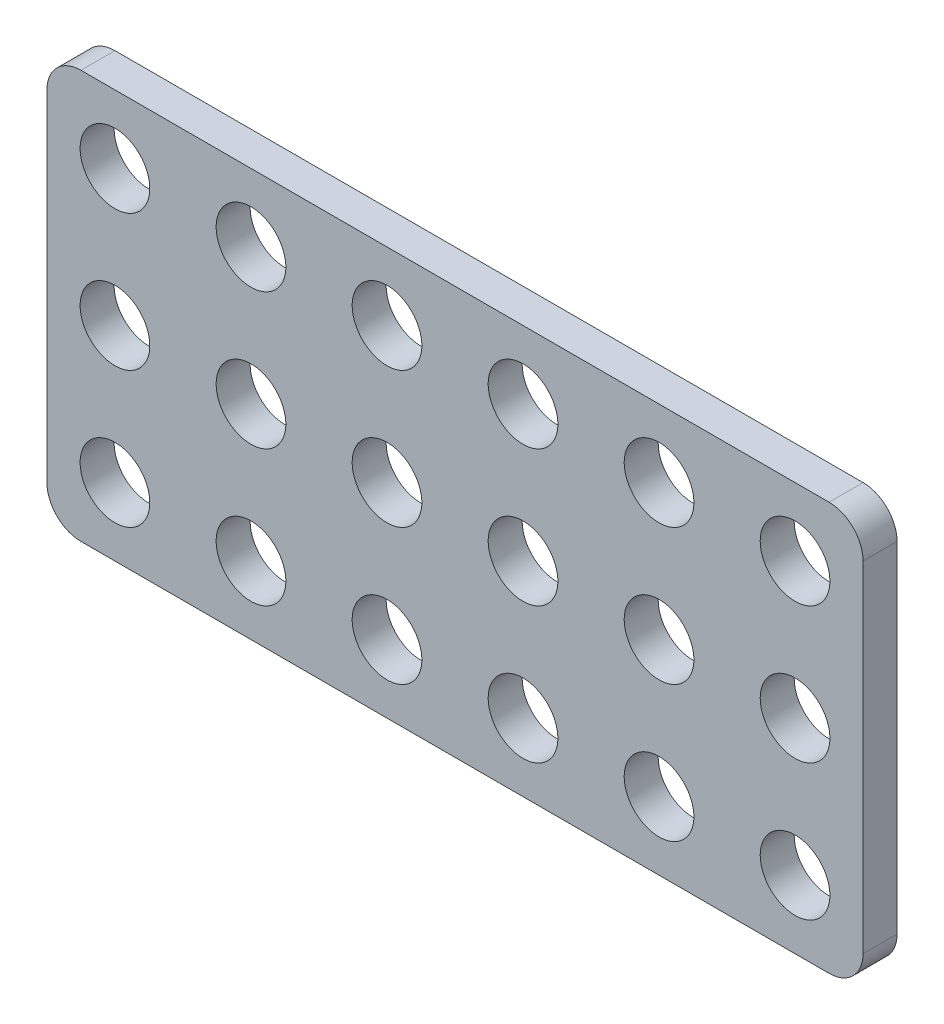
ISO-10303-21;
HEADER;
FILE_DESCRIPTION(('STEP AP214'),'2;1');
FILE_NAME('part.step','',(''),(''),'','','');
FILE_SCHEMA(('AUTOMOTIVE_DESIGN { 1 0 10303 214 1 1 1 1 }'));
ENDSEC;
DATA;
#1=APPLICATION_CONTEXT('core data for automotive mechanical design processes');
#2=APPLICATION_PROTOCOL_DEFINITION('international standard','automotive_design',2000,#1);
#3=PRODUCT_CONTEXT('',#1,'mechanical');
#4=PRODUCT('Part','Part','',(#3));
#5=PRODUCT_RELATED_PRODUCT_CATEGORY('part','',(#4));
#6=PRODUCT_DEFINITION_FORMATION('','',#4);
#7=PRODUCT_DEFINITION_CONTEXT('part definition',#1,'design');
#8=PRODUCT_DEFINITION('design','',#6,#7);
#9=PRODUCT_DEFINITION_SHAPE('','',#8);
#10=(LENGTH_UNIT() NAMED_UNIT(*) SI_UNIT(.MILLI.,.METRE.));
#11=(NAMED_UNIT(*) PLANE_ANGLE_UNIT() SI_UNIT($,.RADIAN.));
#12=(NAMED_UNIT(*) SI_UNIT($,.STERADIAN.) SOLID_ANGLE_UNIT());
#13=UNCERTAINTY_MEASURE_WITH_UNIT(LENGTH_MEASURE(1.E-05),#10,'distance_accuracy_value','');
#14=(GEOMETRIC_REPRESENTATION_CONTEXT(3) GLOBAL_UNCERTAINTY_ASSIGNED_CONTEXT((#13)) GLOBAL_UNIT_ASSIGNED_CONTEXT((#10,
#11,#12)) REPRESENTATION_CONTEXT('',''));
#15=CARTESIAN_POINT('',(0.,0.,0.));
#16=DIRECTION('',(0.,0.,1.));
#17=DIRECTION('',(1.,0.,0.));
#18=AXIS2_PLACEMENT_3D('',#15,#16,#17);
#19=CARTESIAN_POINT('',(-4.,-4.,0.));
#20=DIRECTION('',(0.,0.,1.));
#21=DIRECTION('',(1.,0.,0.));
#22=AXIS2_PLACEMENT_3D('',#19,#20,#21);
#23=PLANE('',#22);
#24=CARTESIAN_POINT('',(39.9999999999999,16.,0.));
#25=DIRECTION('',(0.,0.,-1.));
#26=DIRECTION('',(-1.,0.,0.));
#27=AXIS2_PLACEMENT_3D('',#24,#25,#26);
#28=CIRCLE('',#27,2.05);
#29=CARTESIAN_POINT('',(37.9499999999999,16.,0.));
#30=VERTEX_POINT('',#29);
#31=EDGE_CURVE('E184',#30,#30,#28,.F.);
#32=ORIENTED_EDGE('',*,*,#31,.T.);
#33=EDGE_LOOP('',(#32));
#34=FACE_BOUND('',#33,.T.);
#35=CARTESIAN_POINT('',(23.9999999999999,16.,0.));
#36=DIRECTION('',(0.,0.,-1.));
#37=DIRECTION('',(-1.,0.,0.));
#38=AXIS2_PLACEMENT_3D('',#35,#36,#37);
#39=CIRCLE('',#38,2.05);
#40=CARTESIAN_POINT('',(21.9499999999999,16.,0.));
#41=VERTEX_POINT('',#40);
#42=EDGE_CURVE('E187',#41,#41,#39,.F.);
#43=ORIENTED_EDGE('',*,*,#42,.T.);
#44=EDGE_LOOP('',(#43));
#45=FACE_BOUND('',#44,.T.);
#46=CARTESIAN_POINT('',(7.99999999999994,16.,0.));
#47=DIRECTION('',(0.,0.,-1.));
#48=DIRECTION('',(-1.,0.,0.));
#49=AXIS2_PLACEMENT_3D('',#46,#47,#48);
#50=CIRCLE('',#49,2.05);
#51=CARTESIAN_POINT('',(5.94999999999995,16.,0.));
#52=VERTEX_POINT('',#51);
#53=EDGE_CURVE('E190',#52,#52,#50,.F.);
#54=ORIENTED_EDGE('',*,*,#53,.T.);
#55=EDGE_LOOP('',(#54));
#56=FACE_BOUND('',#55,.T.);
#57=CARTESIAN_POINT('',(40.,8.,0.));
#58=DIRECTION('',(0.,0.,-1.));
#59=DIRECTION('',(-1.,0.,0.));
#60=AXIS2_PLACEMENT_3D('',#57,#58,#59);
#61=CIRCLE('',#60,2.05);
#62=CARTESIAN_POINT('',(37.95,8.,0.));
#63=VERTEX_POINT('',#62);
#64=EDGE_CURVE('E193',#63,#63,#61,.F.);
#65=ORIENTED_EDGE('',*,*,#64,.T.);
#66=EDGE_LOOP('',(#65));
#67=FACE_BOUND('',#66,.T.);
#68=CARTESIAN_POINT('',(24.,8.,0.));
#69=DIRECTION('',(0.,0.,-1.));
#70=DIRECTION('',(-1.,0.,0.));
#71=AXIS2_PLACEMENT_3D('',#68,#69,#70);
#72=CIRCLE('',#71,2.05);
#73=CARTESIAN_POINT('',(21.95,8.,0.));
#74=VERTEX_POINT('',#73);
#75=EDGE_CURVE('E196',#74,#74,#72,.F.);
#76=ORIENTED_EDGE('',*,*,#75,.T.);
#77=EDGE_LOOP('',(#76));
#78=FACE_BOUND('',#77,.T.);
#79=CARTESIAN_POINT('',(7.99999999999997,8.,0.));
#80=DIRECTION('',(0.,0.,-1.));
#81=DIRECTION('',(-1.,0.,0.));
#82=AXIS2_PLACEMENT_3D('',#79,#80,#81);
#83=CIRCLE('',#82,2.05);
#84=CARTESIAN_POINT('',(5.94999999999997,8.,0.));
#85=VERTEX_POINT('',#84);
#86=EDGE_CURVE('E199',#85,#85,#83,.F.);
#87=ORIENTED_EDGE('',*,*,#86,.T.);
#88=EDGE_LOOP('',(#87));
#89=FACE_BOUND('',#88,.T.);
#90=CARTESIAN_POINT('',(40.,0.,0.));
#91=DIRECTION('',(0.,0.,-1.));
#92=DIRECTION('',(-1.,0.,0.));
#93=AXIS2_PLACEMENT_3D('',#90,#91,#92);
#94=CIRCLE('',#93,2.05);
#95=CARTESIAN_POINT('',(37.95,0.,0.));
#96=VERTEX_POINT('',#95);
#97=EDGE_CURVE('E202',#96,#96,#94,.F.);
#98=ORIENTED_EDGE('',*,*,#97,.T.);
#99=EDGE_LOOP('',(#98));
#100=FACE_BOUND('',#99,.T.);
#101=CARTESIAN_POINT('',(24.,0.,0.));
#102=DIRECTION('',(0.,0.,-1.));
#103=DIRECTION('',(-1.,0.,0.));
#104=AXIS2_PLACEMENT_3D('',#101,#102,#103);
#105=CIRCLE('',#104,2.05);
#106=CARTESIAN_POINT('',(21.95,0.,0.));
#107=VERTEX_POINT('',#106);
#108=EDGE_CURVE('E205',#107,#107,#105,.F.);
#109=ORIENTED_EDGE('',*,*,#108,.T.);
#110=EDGE_LOOP('',(#109));
#111=FACE_BOUND('',#110,.T.);
#112=CARTESIAN_POINT('',(8.,0.,0.));
#113=DIRECTION('',(0.,0.,-1.));
#114=DIRECTION('',(-1.,0.,0.));
#115=AXIS2_PLACEMENT_3D('',#112,#113,#114);
#116=CIRCLE('',#115,2.05);
#117=CARTESIAN_POINT('',(5.95,0.,0.));
#118=VERTEX_POINT('',#117);
#119=EDGE_CURVE('E208',#118,#118,#116,.F.);
#120=ORIENTED_EDGE('',*,*,#119,.T.);
#121=EDGE_LOOP('',(#120));
#122=FACE_BOUND('',#121,.T.);
#123=CARTESIAN_POINT('',(-2.,-2.,0.));
#124=DIRECTION('',(0.,0.,-1.));
#125=DIRECTION('',(-1.,0.,0.));
#126=AXIS2_PLACEMENT_3D('',#123,#124,#125);
#127=CIRCLE('',#126,2.);
#128=CARTESIAN_POINT('',(-4.,-2.,0.));
#129=VERTEX_POINT('',#128);
#130=CARTESIAN_POINT('',(-2.,-4.,0.));
#131=VERTEX_POINT('',#130);
#132=EDGE_CURVE('E86',#129,#131,#127,.F.);
#133=ORIENTED_EDGE('',*,*,#132,.F.);
#134=DIRECTION('',(0.,1.,0.));
#135=VECTOR('',#134,1.);
#136=CARTESIAN_POINT('',(-4.,20.,0.));
#137=LINE('',#136,#135);
#138=CARTESIAN_POINT('',(-4.,18.,0.));
#139=VERTEX_POINT('',#138);
#140=EDGE_CURVE('E78',#129,#139,#137,.T.);
#141=ORIENTED_EDGE('',*,*,#140,.T.);
#142=CARTESIAN_POINT('',(-2.,18.,0.));
#143=DIRECTION('',(0.,0.,-1.));
#144=DIRECTION('',(-1.,0.,0.));
#145=AXIS2_PLACEMENT_3D('',#142,#143,#144);
#146=CIRCLE('',#145,2.);
#147=CARTESIAN_POINT('',(-2.,20.,0.));
#148=VERTEX_POINT('',#147);
#149=EDGE_CURVE('E212',#148,#139,#146,.F.);
#150=ORIENTED_EDGE('',*,*,#149,.F.);
#151=DIRECTION('',(1.,0.,0.));
#152=VECTOR('',#151,1.);
#153=CARTESIAN_POINT('',(-4.,20.,0.));
#154=LINE('',#153,#152);
#155=CARTESIAN_POINT('',(42.,20.,0.));
#156=VERTEX_POINT('',#155);
#157=EDGE_CURVE('E113',#148,#156,#154,.T.);
#158=ORIENTED_EDGE('',*,*,#157,.T.);
#159=CARTESIAN_POINT('',(42.,18.,0.));
#160=DIRECTION('',(0.,0.,-1.));
#161=DIRECTION('',(-1.,0.,0.));
#162=AXIS2_PLACEMENT_3D('',#159,#160,#161);
#163=CIRCLE('',#162,2.);
#164=CARTESIAN_POINT('',(44.,18.,0.));
#165=VERTEX_POINT('',#164);
#166=EDGE_CURVE('E215',#165,#156,#163,.F.);
#167=ORIENTED_EDGE('',*,*,#166,.F.);
#168=DIRECTION('',(0.,-1.,0.));
#169=VECTOR('',#168,1.);
#170=CARTESIAN_POINT('',(44.,20.,0.));
#171=LINE('',#170,#169);
#172=CARTESIAN_POINT('',(44.,-2.,0.));
#173=VERTEX_POINT('',#172);
#174=EDGE_CURVE('E117',#165,#173,#171,.T.);
#175=ORIENTED_EDGE('',*,*,#174,.T.);
#176=CARTESIAN_POINT('',(42.,-2.,0.));
#177=DIRECTION('',(0.,0.,-1.));
#178=DIRECTION('',(-1.,0.,0.));
#179=AXIS2_PLACEMENT_3D('',#176,#177,#178);
#180=CIRCLE('',#179,2.);
#181=CARTESIAN_POINT('',(42.,-4.,0.));
#182=VERTEX_POINT('',#181);
#183=EDGE_CURVE('E89',#182,#173,#180,.F.);
#184=ORIENTED_EDGE('',*,*,#183,.F.);
#185=DIRECTION('',(1.,0.,0.));
#186=VECTOR('',#185,1.);
#187=CARTESIAN_POINT('',(-4.,-4.,0.));
#188=LINE('',#187,#186);
#189=EDGE_CURVE('E83',#182,#131,#188,.F.);
#190=ORIENTED_EDGE('',*,*,#189,.T.);
#191=EDGE_LOOP('',(#133,#141,#150,#158,#167,#175,#184,#190));
#192=FACE_BOUND('',#191,.T.);
#193=CARTESIAN_POINT('',(0.,0.,0.));
#194=DIRECTION('',(0.,0.,-1.));
#195=DIRECTION('',(-1.,0.,0.));
#196=AXIS2_PLACEMENT_3D('',#193,#194,#195);
#197=CIRCLE('',#196,2.05);
#198=CARTESIAN_POINT('',(-2.05,0.,0.));
#199=VERTEX_POINT('',#198);
#200=EDGE_CURVE('E112',#199,#199,#197,.F.);
#201=ORIENTED_EDGE('',*,*,#200,.T.);
#202=EDGE_LOOP('',(#201));
#203=FACE_BOUND('',#202,.T.);
#204=CARTESIAN_POINT('',(16.,0.,0.));
#205=DIRECTION('',(0.,0.,-1.));
#206=DIRECTION('',(-1.,0.,0.));
#207=AXIS2_PLACEMENT_3D('',#204,#205,#206);
#208=CIRCLE('',#207,2.05);
#209=CARTESIAN_POINT('',(13.95,0.,0.));
#210=VERTEX_POINT('',#209);
#211=EDGE_CURVE('E221',#210,#210,#208,.F.);
#212=ORIENTED_EDGE('',*,*,#211,.T.);
#213=EDGE_LOOP('',(#212));
#214=FACE_BOUND('',#213,.T.);
#215=CARTESIAN_POINT('',(32.,0.,0.));
#216=DIRECTION('',(0.,0.,-1.));
#217=DIRECTION('',(-1.,0.,0.));
#218=AXIS2_PLACEMENT_3D('',#215,#216,#217);
#219=CIRCLE('',#218,2.05);
#220=CARTESIAN_POINT('',(29.95,0.,0.));
#221=VERTEX_POINT('',#220);
#222=EDGE_CURVE('E224',#221,#221,#219,.F.);
#223=ORIENTED_EDGE('',*,*,#222,.T.);
#224=EDGE_LOOP('',(#223));
#225=FACE_BOUND('',#224,.T.);
#226=CARTESIAN_POINT('',(0.,8.,0.));
#227=DIRECTION('',(0.,0.,-1.));
#228=DIRECTION('',(-1.,0.,0.));
#229=AXIS2_PLACEMENT_3D('',#226,#227,#228);
#230=CIRCLE('',#229,2.05);
#231=CARTESIAN_POINT('',(-2.05000000000003,8.,0.));
#232=VERTEX_POINT('',#231);
#233=EDGE_CURVE('E227',#232,#232,#230,.F.);
#234=ORIENTED_EDGE('',*,*,#233,.T.);
#235=EDGE_LOOP('',(#234));
#236=FACE_BOUND('',#235,.T.);
#237=CARTESIAN_POINT('',(16.,8.,0.));
#238=DIRECTION('',(0.,0.,-1.));
#239=DIRECTION('',(-1.,0.,0.));
#240=AXIS2_PLACEMENT_3D('',#237,#238,#239);
#241=CIRCLE('',#240,2.05);
#242=CARTESIAN_POINT('',(13.95,8.,0.));
#243=VERTEX_POINT('',#242);
#244=EDGE_CURVE('E230',#243,#243,#241,.F.);
#245=ORIENTED_EDGE('',*,*,#244,.T.);
#246=EDGE_LOOP('',(#245));
#247=FACE_BOUND('',#246,.T.);
#248=CARTESIAN_POINT('',(32.,8.,0.));
#249=DIRECTION('',(0.,0.,-1.));
#250=DIRECTION('',(-1.,0.,0.));
#251=AXIS2_PLACEMENT_3D('',#248,#249,#250);
#252=CIRCLE('',#251,2.05);
#253=CARTESIAN_POINT('',(29.95,8.,0.));
#254=VERTEX_POINT('',#253);
#255=EDGE_CURVE('E233',#254,#254,#252,.F.);
#256=ORIENTED_EDGE('',*,*,#255,.T.);
#257=EDGE_LOOP('',(#256));
#258=FACE_BOUND('',#257,.T.);
#259=CARTESIAN_POINT('',(0.,16.,0.));
#260=DIRECTION('',(0.,0.,-1.));
#261=DIRECTION('',(-1.,0.,0.));
#262=AXIS2_PLACEMENT_3D('',#259,#260,#261);
#263=CIRCLE('',#262,2.05);
#264=CARTESIAN_POINT('',(-2.05000000000006,16.,0.));
#265=VERTEX_POINT('',#264);
#266=EDGE_CURVE('E236',#265,#265,#263,.F.);
#267=ORIENTED_EDGE('',*,*,#266,.T.);
#268=EDGE_LOOP('',(#267));
#269=FACE_BOUND('',#268,.T.);
#270=CARTESIAN_POINT('',(15.9999999999999,16.,0.));
#271=DIRECTION('',(0.,0.,-1.));
#272=DIRECTION('',(-1.,0.,0.));
#273=AXIS2_PLACEMENT_3D('',#270,#271,#272);
#274=CIRCLE('',#273,2.05);
#275=CARTESIAN_POINT('',(13.9499999999999,16.,0.));
#276=VERTEX_POINT('',#275);
#277=EDGE_CURVE('E238',#276,#276,#274,.F.);
#278=ORIENTED_EDGE('',*,*,#277,.T.);
#279=EDGE_LOOP('',(#278));
#280=FACE_BOUND('',#279,.T.);
#281=CARTESIAN_POINT('',(31.9999999999999,16.,0.));
#282=DIRECTION('',(0.,0.,-1.));
#283=DIRECTION('',(-1.,0.,0.));
#284=AXIS2_PLACEMENT_3D('',#281,#282,#283);
#285=CIRCLE('',#284,2.05);
#286=CARTESIAN_POINT('',(29.9499999999999,16.,0.));
#287=VERTEX_POINT('',#286);
#288=EDGE_CURVE('E20',#287,#287,#285,.F.);
#289=ORIENTED_EDGE('',*,*,#288,.T.);
#290=EDGE_LOOP('',(#289));
#291=FACE_BOUND('',#290,.T.);
#292=ADVANCED_FACE('F17',(#34,#45,#56,#67,#78,#89,#100,#111,#122,#192,#203,#214,#225,#236,#247,
#258,#269,#280,#291),#23,.F.);
#293=CARTESIAN_POINT('',(31.9999999999999,16.,2.));
#294=DIRECTION('',(0.,0.,-1.));
#295=DIRECTION('',(-1.,0.,0.));
#296=AXIS2_PLACEMENT_3D('',#293,#294,#295);
#297=CYLINDRICAL_SURFACE('',#296,2.05);
#298=CARTESIAN_POINT('',(31.9999999999999,16.,2.));
#299=DIRECTION('',(0.,0.,-1.));
#300=DIRECTION('',(-1.,0.,0.));
#301=AXIS2_PLACEMENT_3D('',#298,#299,#300);
#302=CIRCLE('',#301,2.05);
#303=CARTESIAN_POINT('',(29.9499999999999,16.,2.));
#304=VERTEX_POINT('',#303);
#305=EDGE_CURVE('E181',#304,#304,#302,.T.);
#306=ORIENTED_EDGE('',*,*,#305,.F.);
#307=EDGE_LOOP('',(#306));
#308=FACE_BOUND('',#307,.T.);
#309=ORIENTED_EDGE('',*,*,#288,.F.);
#310=EDGE_LOOP('',(#309));
#311=FACE_BOUND('',#310,.T.);
#312=ADVANCED_FACE('F246',(#308,#311),#297,.F.);
#313=CARTESIAN_POINT('',(15.9999999999999,16.,2.));
#314=DIRECTION('',(0.,0.,-1.));
#315=DIRECTION('',(-1.,0.,0.));
#316=AXIS2_PLACEMENT_3D('',#313,#314,#315);
#317=CYLINDRICAL_SURFACE('',#316,2.05);
#318=CARTESIAN_POINT('',(15.9999999999999,16.,2.));
#319=DIRECTION('',(0.,0.,-1.));
#320=DIRECTION('',(-1.,0.,0.));
#321=AXIS2_PLACEMENT_3D('',#318,#319,#320);
#322=CIRCLE('',#321,2.05);
#323=CARTESIAN_POINT('',(13.9499999999999,16.,2.));
#324=VERTEX_POINT('',#323);
#325=EDGE_CURVE('E178',#324,#324,#322,.T.);
#326=ORIENTED_EDGE('',*,*,#325,.F.);
#327=EDGE_LOOP('',(#326));
#328=FACE_BOUND('',#327,.T.);
#329=ORIENTED_EDGE('',*,*,#277,.F.);
#330=EDGE_LOOP('',(#329));
#331=FACE_BOUND('',#330,.T.);
#332=ADVANCED_FACE('F248',(#328,#331),#317,.F.);
#333=CARTESIAN_POINT('',(0.,16.,2.));
#334=DIRECTION('',(0.,0.,-1.));
#335=DIRECTION('',(-1.,0.,0.));
#336=AXIS2_PLACEMENT_3D('',#333,#334,#335);
#337=CYLINDRICAL_SURFACE('',#336,2.05);
#338=CARTESIAN_POINT('',(0.,16.,2.));
#339=DIRECTION('',(0.,0.,-1.));
#340=DIRECTION('',(-1.,0.,0.));
#341=AXIS2_PLACEMENT_3D('',#338,#339,#340);
#342=CIRCLE('',#341,2.05);
#343=CARTESIAN_POINT('',(-2.05000000000006,16.,2.));
#344=VERTEX_POINT('',#343);
#345=EDGE_CURVE('E175',#344,#344,#342,.T.);
#346=ORIENTED_EDGE('',*,*,#345,.F.);
#347=EDGE_LOOP('',(#346));
#348=FACE_BOUND('',#347,.T.);
#349=ORIENTED_EDGE('',*,*,#266,.F.);
#350=EDGE_LOOP('',(#349));
#351=FACE_BOUND('',#350,.T.);
#352=ADVANCED_FACE('F255',(#348,#351),#337,.F.);
#353=CARTESIAN_POINT('',(32.,8.,2.));
#354=DIRECTION('',(0.,0.,-1.));
#355=DIRECTION('',(-1.,0.,0.));
#356=AXIS2_PLACEMENT_3D('',#353,#354,#355);
#357=CYLINDRICAL_SURFACE('',#356,2.05);
#358=CARTESIAN_POINT('',(32.,8.,2.));
#359=DIRECTION('',(0.,0.,-1.));
#360=DIRECTION('',(-1.,0.,0.));
#361=AXIS2_PLACEMENT_3D('',#358,#359,#360);
#362=CIRCLE('',#361,2.05);
#363=CARTESIAN_POINT('',(29.95,8.,2.));
#364=VERTEX_POINT('',#363);
#365=EDGE_CURVE('E172',#364,#364,#362,.T.);
#366=ORIENTED_EDGE('',*,*,#365,.F.);
#367=EDGE_LOOP('',(#366));
#368=FACE_BOUND('',#367,.T.);
#369=ORIENTED_EDGE('',*,*,#255,.F.);
#370=EDGE_LOOP('',(#369));
#371=FACE_BOUND('',#370,.T.);
#372=ADVANCED_FACE('F349',(#368,#371),#357,.F.);
#373=CARTESIAN_POINT('',(16.,8.,2.));
#374=DIRECTION('',(0.,0.,-1.));
#375=DIRECTION('',(-1.,0.,0.));
#376=AXIS2_PLACEMENT_3D('',#373,#374,#375);
#377=CYLINDRICAL_SURFACE('',#376,2.05);
#378=CARTESIAN_POINT('',(16.,8.,2.));
#379=DIRECTION('',(0.,0.,-1.));
#380=DIRECTION('',(-1.,0.,0.));
#381=AXIS2_PLACEMENT_3D('',#378,#379,#380);
#382=CIRCLE('',#381,2.05);
#383=CARTESIAN_POINT('',(13.95,8.,2.));
#384=VERTEX_POINT('',#383);
#385=EDGE_CURVE('E169',#384,#384,#382,.T.);
#386=ORIENTED_EDGE('',*,*,#385,.F.);
#387=EDGE_LOOP('',(#386));
#388=FACE_BOUND('',#387,.T.);
#389=ORIENTED_EDGE('',*,*,#244,.F.);
#390=EDGE_LOOP('',(#389));
#391=FACE_BOUND('',#390,.T.);
#392=ADVANCED_FACE('F345',(#388,#391),#377,.F.);
#393=CARTESIAN_POINT('',(0.,8.,2.));
#394=DIRECTION('',(0.,0.,-1.));
#395=DIRECTION('',(-1.,0.,0.));
#396=AXIS2_PLACEMENT_3D('',#393,#394,#395);
#397=CYLINDRICAL_SURFACE('',#396,2.05);
#398=CARTESIAN_POINT('',(0.,8.,2.));
#399=DIRECTION('',(0.,0.,-1.));
#400=DIRECTION('',(-1.,0.,0.));
#401=AXIS2_PLACEMENT_3D('',#398,#399,#400);
#402=CIRCLE('',#401,2.05);
#403=CARTESIAN_POINT('',(-2.05000000000003,8.,2.));
#404=VERTEX_POINT('',#403);
#405=EDGE_CURVE('E166',#404,#404,#402,.T.);
#406=ORIENTED_EDGE('',*,*,#405,.F.);
#407=EDGE_LOOP('',(#406));
#408=FACE_BOUND('',#407,.T.);
#409=ORIENTED_EDGE('',*,*,#233,.F.);
#410=EDGE_LOOP('',(#409));
#411=FACE_BOUND('',#410,.T.);
#412=ADVANCED_FACE('F341',(#408,#411),#397,.F.);
#413=CARTESIAN_POINT('',(32.,0.,2.));
#414=DIRECTION('',(0.,0.,-1.));
#415=DIRECTION('',(-1.,0.,0.));
#416=AXIS2_PLACEMENT_3D('',#413,#414,#415);
#417=CYLINDRICAL_SURFACE('',#416,2.05);
#418=CARTESIAN_POINT('',(32.,0.,2.));
#419=DIRECTION('',(0.,0.,-1.));
#420=DIRECTION('',(-1.,0.,0.));
#421=AXIS2_PLACEMENT_3D('',#418,#419,#420);
#422=CIRCLE('',#421,2.05);
#423=CARTESIAN_POINT('',(29.95,0.,2.));
#424=VERTEX_POINT('',#423);
#425=EDGE_CURVE('E163',#424,#424,#422,.T.);
#426=ORIENTED_EDGE('',*,*,#425,.F.);
#427=EDGE_LOOP('',(#426));
#428=FACE_BOUND('',#427,.T.);
#429=ORIENTED_EDGE('',*,*,#222,.F.);
#430=EDGE_LOOP('',(#429));
#431=FACE_BOUND('',#430,.T.);
#432=ADVANCED_FACE('F337',(#428,#431),#417,.F.);
#433=CARTESIAN_POINT('',(16.,0.,2.));
#434=DIRECTION('',(0.,0.,-1.));
#435=DIRECTION('',(-1.,0.,0.));
#436=AXIS2_PLACEMENT_3D('',#433,#434,#435);
#437=CYLINDRICAL_SURFACE('',#436,2.05);
#438=CARTESIAN_POINT('',(16.,0.,2.));
#439=DIRECTION('',(0.,0.,-1.));
#440=DIRECTION('',(-1.,0.,0.));
#441=AXIS2_PLACEMENT_3D('',#438,#439,#440);
#442=CIRCLE('',#441,2.05);
#443=CARTESIAN_POINT('',(13.95,0.,2.));
#444=VERTEX_POINT('',#443);
#445=EDGE_CURVE('E160',#444,#444,#442,.T.);
#446=ORIENTED_EDGE('',*,*,#445,.F.);
#447=EDGE_LOOP('',(#446));
#448=FACE_BOUND('',#447,.T.);
#449=ORIENTED_EDGE('',*,*,#211,.F.);
#450=EDGE_LOOP('',(#449));
#451=FACE_BOUND('',#450,.T.);
#452=ADVANCED_FACE('F333',(#448,#451),#437,.F.);
#453=CARTESIAN_POINT('',(0.,0.,2.));
#454=DIRECTION('',(0.,0.,-1.));
#455=DIRECTION('',(-1.,0.,0.));
#456=AXIS2_PLACEMENT_3D('',#453,#454,#455);
#457=CYLINDRICAL_SURFACE('',#456,2.05);
#458=CARTESIAN_POINT('',(0.,0.,2.));
#459=DIRECTION('',(0.,0.,-1.));
#460=DIRECTION('',(-1.,0.,0.));
#461=AXIS2_PLACEMENT_3D('',#458,#459,#460);
#462=CIRCLE('',#461,2.05);
#463=CARTESIAN_POINT('',(-2.05,0.,2.));
#464=VERTEX_POINT('',#463);
#465=EDGE_CURVE('E157',#464,#464,#462,.T.);
#466=ORIENTED_EDGE('',*,*,#465,.F.);
#467=EDGE_LOOP('',(#466));
#468=FACE_BOUND('',#467,.T.);
#469=ORIENTED_EDGE('',*,*,#200,.F.);
#470=EDGE_LOOP('',(#469));
#471=FACE_BOUND('',#470,.T.);
#472=ADVANCED_FACE('F330',(#468,#471),#457,.F.);
#473=CARTESIAN_POINT('',(-4.,20.,2.));
#474=DIRECTION('',(1.,0.,0.));
#475=DIRECTION('',(0.,1.,0.));
#476=AXIS2_PLACEMENT_3D('',#473,#474,#475);
#477=PLANE('',#476);
#478=DIRECTION('',(0.,0.,-1.));
#479=VECTOR('',#478,1.);
#480=CARTESIAN_POINT('',(-4.,-2.,2.));
#481=LINE('',#480,#479);
#482=CARTESIAN_POINT('',(-4.,-2.,2.));
#483=VERTEX_POINT('',#482);
#484=EDGE_CURVE('E99',#483,#129,#481,.T.);
#485=ORIENTED_EDGE('',*,*,#484,.F.);
#486=DIRECTION('',(0.,1.,0.));
#487=VECTOR('',#486,1.);
#488=CARTESIAN_POINT('',(-4.,-4.,2.));
#489=LINE('',#488,#487);
#490=CARTESIAN_POINT('',(-4.,18.,2.));
#491=VERTEX_POINT('',#490);
#492=EDGE_CURVE('E156',#491,#483,#489,.F.);
#493=ORIENTED_EDGE('',*,*,#492,.F.);
#494=DIRECTION('',(0.,0.,-1.));
#495=VECTOR('',#494,1.);
#496=CARTESIAN_POINT('',(-4.,18.,2.));
#497=LINE('',#496,#495);
#498=EDGE_CURVE('E211',#139,#491,#497,.F.);
#499=ORIENTED_EDGE('',*,*,#498,.F.);
#500=ORIENTED_EDGE('',*,*,#140,.F.);
#501=EDGE_LOOP('',(#485,#493,#499,#500));
#502=FACE_BOUND('',#501,.T.);
#503=ADVANCED_FACE('F327',(#502),#477,.F.);
#504=CARTESIAN_POINT('',(-2.,-2.,2.));
#505=DIRECTION('',(0.,0.,-1.));
#506=DIRECTION('',(-1.,0.,0.));
#507=AXIS2_PLACEMENT_3D('',#504,#505,#506);
#508=CYLINDRICAL_SURFACE('',#507,2.);
#509=ORIENTED_EDGE('',*,*,#132,.T.);
#510=DIRECTION('',(0.,0.,1.));
#511=VECTOR('',#510,1.);
#512=CARTESIAN_POINT('',(-2.,-4.,2.));
#513=LINE('',#512,#511);
#514=CARTESIAN_POINT('',(-2.,-4.,2.));
#515=VERTEX_POINT('',#514);
#516=EDGE_CURVE('E93',#131,#515,#513,.T.);
#517=ORIENTED_EDGE('',*,*,#516,.T.);
#518=CARTESIAN_POINT('',(-2.,-2.,2.));
#519=DIRECTION('',(0.,0.,-1.));
#520=DIRECTION('',(-1.,0.,0.));
#521=AXIS2_PLACEMENT_3D('',#518,#519,#520);
#522=CIRCLE('',#521,2.);
#523=EDGE_CURVE('E154',#483,#515,#522,.F.);
#524=ORIENTED_EDGE('',*,*,#523,.F.);
#525=ORIENTED_EDGE('',*,*,#484,.T.);
#526=EDGE_LOOP('',(#509,#517,#524,#525));
#527=FACE_BOUND('',#526,.T.);
#528=ADVANCED_FACE('F96',(#527),#508,.T.);
#529=CARTESIAN_POINT('',(-4.,-4.,2.));
#530=DIRECTION('',(0.,1.,0.));
#531=DIRECTION('',(0.,0.,1.));
#532=AXIS2_PLACEMENT_3D('',#529,#530,#531);
#533=PLANE('',#532);
#534=ORIENTED_EDGE('',*,*,#516,.F.);
#535=ORIENTED_EDGE('',*,*,#189,.F.);
#536=DIRECTION('',(0.,0.,-1.));
#537=VECTOR('',#536,1.);
#538=CARTESIAN_POINT('',(42.,-4.,2.));
#539=LINE('',#538,#537);
#540=CARTESIAN_POINT('',(42.,-4.,2.));
#541=VERTEX_POINT('',#540);
#542=EDGE_CURVE('E105',#541,#182,#539,.T.);
#543=ORIENTED_EDGE('',*,*,#542,.F.);
#544=DIRECTION('',(1.,0.,0.));
#545=VECTOR('',#544,1.);
#546=CARTESIAN_POINT('',(-4.,-4.,2.));
#547=LINE('',#546,#545);
#548=EDGE_CURVE('E103',#515,#541,#547,.T.);
#549=ORIENTED_EDGE('',*,*,#548,.F.);
#550=EDGE_LOOP('',(#534,#535,#543,#549));
#551=FACE_BOUND('',#550,.T.);
#552=ADVANCED_FACE('F101',(#551),#533,.F.);
#553=CARTESIAN_POINT('',(42.,-2.,2.));
#554=DIRECTION('',(0.,0.,-1.));
#555=DIRECTION('',(-1.,0.,0.));
#556=AXIS2_PLACEMENT_3D('',#553,#554,#555);
#557=CYLINDRICAL_SURFACE('',#556,2.);
#558=ORIENTED_EDGE('',*,*,#183,.T.);
#559=DIRECTION('',(0.,0.,1.));
#560=VECTOR('',#559,1.);
#561=CARTESIAN_POINT('',(44.,-2.,2.));
#562=LINE('',#561,#560);
#563=CARTESIAN_POINT('',(44.,-2.,2.));
#564=VERTEX_POINT('',#563);
#565=EDGE_CURVE('E118',#173,#564,#562,.T.);
#566=ORIENTED_EDGE('',*,*,#565,.T.);
#567=CARTESIAN_POINT('',(42.,-2.,2.));
#568=DIRECTION('',(0.,0.,-1.));
#569=DIRECTION('',(-1.,0.,0.));
#570=AXIS2_PLACEMENT_3D('',#567,#568,#569);
#571=CIRCLE('',#570,2.);
#572=EDGE_CURVE('E151',#541,#564,#571,.F.);
#573=ORIENTED_EDGE('',*,*,#572,.F.);
#574=ORIENTED_EDGE('',*,*,#542,.T.);
#575=EDGE_LOOP('',(#558,#566,#573,#574));
#576=FACE_BOUND('',#575,.T.);
#577=ADVANCED_FACE('F318',(#576),#557,.T.);
#578=CARTESIAN_POINT('',(44.,20.,2.));
#579=DIRECTION('',(-1.,0.,0.));
#580=DIRECTION('',(0.,-1.,0.));
#581=AXIS2_PLACEMENT_3D('',#578,#579,#580);
#582=PLANE('',#581);
#583=ORIENTED_EDGE('',*,*,#565,.F.);
#584=ORIENTED_EDGE('',*,*,#174,.F.);
#585=DIRECTION('',(0.,0.,-1.));
#586=VECTOR('',#585,1.);
#587=CARTESIAN_POINT('',(44.,18.,2.));
#588=LINE('',#587,#586);
#589=CARTESIAN_POINT('',(44.,18.,2.));
#590=VERTEX_POINT('',#589);
#591=EDGE_CURVE('E217',#590,#165,#588,.T.);
#592=ORIENTED_EDGE('',*,*,#591,.F.);
#593=DIRECTION('',(0.,1.,0.));
#594=VECTOR('',#593,1.);
#595=CARTESIAN_POINT('',(44.,-4.,2.));
#596=LINE('',#595,#594);
#597=EDGE_CURVE('E150',#564,#590,#596,.T.);
#598=ORIENTED_EDGE('',*,*,#597,.F.);
#599=EDGE_LOOP('',(#583,#584,#592,#598));
#600=FACE_BOUND('',#599,.T.);
#601=ADVANCED_FACE('F314',(#600),#582,.F.);
#602=CARTESIAN_POINT('',(42.,18.,2.));
#603=DIRECTION('',(0.,0.,-1.));
#604=DIRECTION('',(-1.,0.,0.));
#605=AXIS2_PLACEMENT_3D('',#602,#603,#604);
#606=CYLINDRICAL_SURFACE('',#605,2.);
#607=ORIENTED_EDGE('',*,*,#166,.T.);
#608=DIRECTION('',(0.,0.,-1.));
#609=VECTOR('',#608,1.);
#610=CARTESIAN_POINT('',(42.,20.,2.));
#611=LINE('',#610,#609);
#612=CARTESIAN_POINT('',(42.,20.,2.));
#613=VERTEX_POINT('',#612);
#614=EDGE_CURVE('E116',#156,#613,#611,.F.);
#615=ORIENTED_EDGE('',*,*,#614,.T.);
#616=CARTESIAN_POINT('',(42.,18.,2.));
#617=DIRECTION('',(0.,0.,-1.));
#618=DIRECTION('',(-1.,0.,0.));
#619=AXIS2_PLACEMENT_3D('',#616,#617,#618);
#620=CIRCLE('',#619,2.);
#621=EDGE_CURVE('E147',#590,#613,#620,.F.);
#622=ORIENTED_EDGE('',*,*,#621,.F.);
#623=ORIENTED_EDGE('',*,*,#591,.T.);
#624=EDGE_LOOP('',(#607,#615,#622,#623));
#625=FACE_BOUND('',#624,.T.);
#626=ADVANCED_FACE('F311',(#625),#606,.T.);
#627=CARTESIAN_POINT('',(-4.,20.,2.));
#628=DIRECTION('',(0.,-1.,0.));
#629=DIRECTION('',(0.,0.,-1.));
#630=AXIS2_PLACEMENT_3D('',#627,#628,#629);
#631=PLANE('',#630);
#632=DIRECTION('',(0.,0.,-1.));
#633=VECTOR('',#632,1.);
#634=CARTESIAN_POINT('',(-2.,20.,2.));
#635=LINE('',#634,#633);
#636=CARTESIAN_POINT('',(-2.,20.,2.));
#637=VERTEX_POINT('',#636);
#638=EDGE_CURVE('E35',#637,#148,#635,.T.);
#639=ORIENTED_EDGE('',*,*,#638,.F.);
#640=DIRECTION('',(1.,0.,0.));
#641=VECTOR('',#640,1.);
#642=CARTESIAN_POINT('',(-4.,20.,2.));
#643=LINE('',#642,#641);
#644=EDGE_CURVE('E146',#613,#637,#643,.F.);
#645=ORIENTED_EDGE('',*,*,#644,.F.);
#646=ORIENTED_EDGE('',*,*,#614,.F.);
#647=ORIENTED_EDGE('',*,*,#157,.F.);
#648=EDGE_LOOP('',(#639,#645,#646,#647));
#649=FACE_BOUND('',#648,.T.);
#650=ADVANCED_FACE('F307',(#649),#631,.F.);
#651=CARTESIAN_POINT('',(-2.,18.,2.));
#652=DIRECTION('',(0.,0.,-1.));
#653=DIRECTION('',(-1.,0.,0.));
#654=AXIS2_PLACEMENT_3D('',#651,#652,#653);
#655=CYLINDRICAL_SURFACE('',#654,2.);
#656=ORIENTED_EDGE('',*,*,#149,.T.);
#657=ORIENTED_EDGE('',*,*,#498,.T.);
#658=CARTESIAN_POINT('',(-2.,18.,2.));
#659=DIRECTION('',(0.,0.,-1.));
#660=DIRECTION('',(-1.,0.,0.));
#661=AXIS2_PLACEMENT_3D('',#658,#659,#660);
#662=CIRCLE('',#661,2.);
#663=EDGE_CURVE('E143',#637,#491,#662,.F.);
#664=ORIENTED_EDGE('',*,*,#663,.F.);
#665=ORIENTED_EDGE('',*,*,#638,.T.);
#666=EDGE_LOOP('',(#656,#657,#664,#665));
#667=FACE_BOUND('',#666,.T.);
#668=ADVANCED_FACE('F303',(#667),#655,.T.);
#669=CARTESIAN_POINT('',(8.,0.,2.));
#670=DIRECTION('',(0.,0.,-1.));
#671=DIRECTION('',(-1.,0.,0.));
#672=AXIS2_PLACEMENT_3D('',#669,#670,#671);
#673=CYLINDRICAL_SURFACE('',#672,2.05);
#674=CARTESIAN_POINT('',(8.,0.,2.));
#675=DIRECTION('',(0.,0.,-1.));
#676=DIRECTION('',(-1.,0.,0.));
#677=AXIS2_PLACEMENT_3D('',#674,#675,#676);
#678=CIRCLE('',#677,2.05);
#679=CARTESIAN_POINT('',(5.95,0.,2.));
#680=VERTEX_POINT('',#679);
#681=EDGE_CURVE('E140',#680,#680,#678,.T.);
#682=ORIENTED_EDGE('',*,*,#681,.F.);
#683=EDGE_LOOP('',(#682));
#684=FACE_BOUND('',#683,.T.);
#685=ORIENTED_EDGE('',*,*,#119,.F.);
#686=EDGE_LOOP('',(#685));
#687=FACE_BOUND('',#686,.T.);
#688=ADVANCED_FACE('F299',(#684,#687),#673,.F.);
#689=CARTESIAN_POINT('',(24.,0.,2.));
#690=DIRECTION('',(0.,0.,-1.));
#691=DIRECTION('',(-1.,0.,0.));
#692=AXIS2_PLACEMENT_3D('',#689,#690,#691);
#693=CYLINDRICAL_SURFACE('',#692,2.05);
#694=CARTESIAN_POINT('',(24.,0.,2.));
#695=DIRECTION('',(0.,0.,-1.));
#696=DIRECTION('',(-1.,0.,0.));
#697=AXIS2_PLACEMENT_3D('',#694,#695,#696);
#698=CIRCLE('',#697,2.05);
#699=CARTESIAN_POINT('',(21.95,0.,2.));
#700=VERTEX_POINT('',#699);
#701=EDGE_CURVE('E137',#700,#700,#698,.T.);
#702=ORIENTED_EDGE('',*,*,#701,.F.);
#703=EDGE_LOOP('',(#702));
#704=FACE_BOUND('',#703,.T.);
#705=ORIENTED_EDGE('',*,*,#108,.F.);
#706=EDGE_LOOP('',(#705));
#707=FACE_BOUND('',#706,.T.);
#708=ADVANCED_FACE('F295',(#704,#707),#693,.F.);
#709=CARTESIAN_POINT('',(40.,0.,2.));
#710=DIRECTION('',(0.,0.,-1.));
#711=DIRECTION('',(-1.,0.,0.));
#712=AXIS2_PLACEMENT_3D('',#709,#710,#711);
#713=CYLINDRICAL_SURFACE('',#712,2.05);
#714=CARTESIAN_POINT('',(40.,0.,2.));
#715=DIRECTION('',(0.,0.,-1.));
#716=DIRECTION('',(-1.,0.,0.));
#717=AXIS2_PLACEMENT_3D('',#714,#715,#716);
#718=CIRCLE('',#717,2.05);
#719=CARTESIAN_POINT('',(37.95,0.,2.));
#720=VERTEX_POINT('',#719);
#721=EDGE_CURVE('E134',#720,#720,#718,.T.);
#722=ORIENTED_EDGE('',*,*,#721,.F.);
#723=EDGE_LOOP('',(#722));
#724=FACE_BOUND('',#723,.T.);
#725=ORIENTED_EDGE('',*,*,#97,.F.);
#726=EDGE_LOOP('',(#725));
#727=FACE_BOUND('',#726,.T.);
#728=ADVANCED_FACE('F291',(#724,#727),#713,.F.);
#729=CARTESIAN_POINT('',(7.99999999999997,8.,2.));
#730=DIRECTION('',(0.,0.,-1.));
#731=DIRECTION('',(-1.,0.,0.));
#732=AXIS2_PLACEMENT_3D('',#729,#730,#731);
#733=CYLINDRICAL_SURFACE('',#732,2.05);
#734=CARTESIAN_POINT('',(7.99999999999997,8.,2.));
#735=DIRECTION('',(0.,0.,-1.));
#736=DIRECTION('',(-1.,0.,0.));
#737=AXIS2_PLACEMENT_3D('',#734,#735,#736);
#738=CIRCLE('',#737,2.05);
#739=CARTESIAN_POINT('',(5.94999999999997,8.,2.));
#740=VERTEX_POINT('',#739);
#741=EDGE_CURVE('E131',#740,#740,#738,.T.);
#742=ORIENTED_EDGE('',*,*,#741,.F.);
#743=EDGE_LOOP('',(#742));
#744=FACE_BOUND('',#743,.T.);
#745=ORIENTED_EDGE('',*,*,#86,.F.);
#746=EDGE_LOOP('',(#745));
#747=FACE_BOUND('',#746,.T.);
#748=ADVANCED_FACE('F287',(#744,#747),#733,.F.);
#749=CARTESIAN_POINT('',(24.,8.,2.));
#750=DIRECTION('',(0.,0.,-1.));
#751=DIRECTION('',(-1.,0.,0.));
#752=AXIS2_PLACEMENT_3D('',#749,#750,#751);
#753=CYLINDRICAL_SURFACE('',#752,2.05);
#754=CARTESIAN_POINT('',(24.,8.,2.));
#755=DIRECTION('',(0.,0.,-1.));
#756=DIRECTION('',(-1.,0.,0.));
#757=AXIS2_PLACEMENT_3D('',#754,#755,#756);
#758=CIRCLE('',#757,2.05);
#759=CARTESIAN_POINT('',(21.95,8.,2.));
#760=VERTEX_POINT('',#759);
#761=EDGE_CURVE('E128',#760,#760,#758,.T.);
#762=ORIENTED_EDGE('',*,*,#761,.F.);
#763=EDGE_LOOP('',(#762));
#764=FACE_BOUND('',#763,.T.);
#765=ORIENTED_EDGE('',*,*,#75,.F.);
#766=EDGE_LOOP('',(#765));
#767=FACE_BOUND('',#766,.T.);
#768=ADVANCED_FACE('F283',(#764,#767),#753,.F.);
#769=CARTESIAN_POINT('',(40.,8.,2.));
#770=DIRECTION('',(0.,0.,-1.));
#771=DIRECTION('',(-1.,0.,0.));
#772=AXIS2_PLACEMENT_3D('',#769,#770,#771);
#773=CYLINDRICAL_SURFACE('',#772,2.05);
#774=CARTESIAN_POINT('',(40.,8.,2.));
#775=DIRECTION('',(0.,0.,-1.));
#776=DIRECTION('',(-1.,0.,0.));
#777=AXIS2_PLACEMENT_3D('',#774,#775,#776);
#778=CIRCLE('',#777,2.05);
#779=CARTESIAN_POINT('',(37.95,8.,2.));
#780=VERTEX_POINT('',#779);
#781=EDGE_CURVE('E125',#780,#780,#778,.T.);
#782=ORIENTED_EDGE('',*,*,#781,.F.);
#783=EDGE_LOOP('',(#782));
#784=FACE_BOUND('',#783,.T.);
#785=ORIENTED_EDGE('',*,*,#64,.F.);
#786=EDGE_LOOP('',(#785));
#787=FACE_BOUND('',#786,.T.);
#788=ADVANCED_FACE('F279',(#784,#787),#773,.F.);
#789=CARTESIAN_POINT('',(7.99999999999994,16.,2.));
#790=DIRECTION('',(0.,0.,-1.));
#791=DIRECTION('',(-1.,0.,0.));
#792=AXIS2_PLACEMENT_3D('',#789,#790,#791);
#793=CYLINDRICAL_SURFACE('',#792,2.05);
#794=CARTESIAN_POINT('',(7.99999999999994,16.,2.));
#795=DIRECTION('',(0.,0.,-1.));
#796=DIRECTION('',(-1.,0.,0.));
#797=AXIS2_PLACEMENT_3D('',#794,#795,#796);
#798=CIRCLE('',#797,2.05);
#799=CARTESIAN_POINT('',(5.94999999999995,16.,2.));
#800=VERTEX_POINT('',#799);
#801=EDGE_CURVE('E122',#800,#800,#798,.T.);
#802=ORIENTED_EDGE('',*,*,#801,.F.);
#803=EDGE_LOOP('',(#802));
#804=FACE_BOUND('',#803,.T.);
#805=ORIENTED_EDGE('',*,*,#53,.F.);
#806=EDGE_LOOP('',(#805));
#807=FACE_BOUND('',#806,.T.);
#808=ADVANCED_FACE('F275',(#804,#807),#793,.F.);
#809=CARTESIAN_POINT('',(23.9999999999999,16.,2.));
#810=DIRECTION('',(0.,0.,-1.));
#811=DIRECTION('',(-1.,0.,0.));
#812=AXIS2_PLACEMENT_3D('',#809,#810,#811);
#813=CYLINDRICAL_SURFACE('',#812,2.05);
#814=CARTESIAN_POINT('',(23.9999999999999,16.,2.));
#815=DIRECTION('',(0.,0.,-1.));
#816=DIRECTION('',(-1.,0.,0.));
#817=AXIS2_PLACEMENT_3D('',#814,#815,#816);
#818=CIRCLE('',#817,2.05);
#819=CARTESIAN_POINT('',(21.9499999999999,16.,2.));
#820=VERTEX_POINT('',#819);
#821=EDGE_CURVE('E26',#820,#820,#818,.T.);
#822=ORIENTED_EDGE('',*,*,#821,.F.);
#823=EDGE_LOOP('',(#822));
#824=FACE_BOUND('',#823,.T.);
#825=ORIENTED_EDGE('',*,*,#42,.F.);
#826=EDGE_LOOP('',(#825));
#827=FACE_BOUND('',#826,.T.);
#828=ADVANCED_FACE('F268',(#824,#827),#813,.F.);
#829=CARTESIAN_POINT('',(39.9999999999999,16.,2.));
#830=DIRECTION('',(0.,0.,-1.));
#831=DIRECTION('',(-1.,0.,0.));
#832=AXIS2_PLACEMENT_3D('',#829,#830,#831);
#833=CYLINDRICAL_SURFACE('',#832,2.05);
#834=CARTESIAN_POINT('',(39.9999999999999,16.,2.));
#835=DIRECTION('',(0.,0.,-1.));
#836=DIRECTION('',(-1.,0.,0.));
#837=AXIS2_PLACEMENT_3D('',#834,#835,#836);
#838=CIRCLE('',#837,2.05);
#839=CARTESIAN_POINT('',(37.9499999999999,16.,2.));
#840=VERTEX_POINT('',#839);
#841=EDGE_CURVE('E10',#840,#840,#838,.T.);
#842=ORIENTED_EDGE('',*,*,#841,.F.);
#843=EDGE_LOOP('',(#842));
#844=FACE_BOUND('',#843,.T.);
#845=ORIENTED_EDGE('',*,*,#31,.F.);
#846=EDGE_LOOP('',(#845));
#847=FACE_BOUND('',#846,.T.);
#848=ADVANCED_FACE('F262',(#844,#847),#833,.F.);
#849=CARTESIAN_POINT('',(-4.,-4.,2.));
#850=DIRECTION('',(0.,0.,1.));
#851=DIRECTION('',(1.,0.,0.));
#852=AXIS2_PLACEMENT_3D('',#849,#850,#851);
#853=PLANE('',#852);
#854=ORIENTED_EDGE('',*,*,#841,.T.);
#855=EDGE_LOOP('',(#854));
#856=FACE_BOUND('',#855,.T.);
#857=ORIENTED_EDGE('',*,*,#821,.T.);
#858=EDGE_LOOP('',(#857));
#859=FACE_BOUND('',#858,.T.);
#860=ORIENTED_EDGE('',*,*,#801,.T.);
#861=EDGE_LOOP('',(#860));
#862=FACE_BOUND('',#861,.T.);
#863=ORIENTED_EDGE('',*,*,#781,.T.);
#864=EDGE_LOOP('',(#863));
#865=FACE_BOUND('',#864,.T.);
#866=ORIENTED_EDGE('',*,*,#761,.T.);
#867=EDGE_LOOP('',(#866));
#868=FACE_BOUND('',#867,.T.);
#869=ORIENTED_EDGE('',*,*,#741,.T.);
#870=EDGE_LOOP('',(#869));
#871=FACE_BOUND('',#870,.T.);
#872=ORIENTED_EDGE('',*,*,#721,.T.);
#873=EDGE_LOOP('',(#872));
#874=FACE_BOUND('',#873,.T.);
#875=ORIENTED_EDGE('',*,*,#701,.T.);
#876=EDGE_LOOP('',(#875));
#877=FACE_BOUND('',#876,.T.);
#878=ORIENTED_EDGE('',*,*,#681,.T.);
#879=EDGE_LOOP('',(#878));
#880=FACE_BOUND('',#879,.T.);
#881=ORIENTED_EDGE('',*,*,#644,.T.);
#882=ORIENTED_EDGE('',*,*,#663,.T.);
#883=ORIENTED_EDGE('',*,*,#492,.T.);
#884=ORIENTED_EDGE('',*,*,#523,.T.);
#885=ORIENTED_EDGE('',*,*,#548,.T.);
#886=ORIENTED_EDGE('',*,*,#572,.T.);
#887=ORIENTED_EDGE('',*,*,#597,.T.);
#888=ORIENTED_EDGE('',*,*,#621,.T.);
#889=EDGE_LOOP('',(#881,#882,#883,#884,#885,#886,#887,#888));
#890=FACE_BOUND('',#889,.T.);
#891=ORIENTED_EDGE('',*,*,#465,.T.);
#892=EDGE_LOOP('',(#891));
#893=FACE_BOUND('',#892,.T.);
#894=ORIENTED_EDGE('',*,*,#445,.T.);
#895=EDGE_LOOP('',(#894));
#896=FACE_BOUND('',#895,.T.);
#897=ORIENTED_EDGE('',*,*,#425,.T.);
#898=EDGE_LOOP('',(#897));
#899=FACE_BOUND('',#898,.T.);
#900=ORIENTED_EDGE('',*,*,#405,.T.);
#901=EDGE_LOOP('',(#900));
#902=FACE_BOUND('',#901,.T.);
#903=ORIENTED_EDGE('',*,*,#385,.T.);
#904=EDGE_LOOP('',(#903));
#905=FACE_BOUND('',#904,.T.);
#906=ORIENTED_EDGE('',*,*,#365,.T.);
#907=EDGE_LOOP('',(#906));
#908=FACE_BOUND('',#907,.T.);
#909=ORIENTED_EDGE('',*,*,#345,.T.);
#910=EDGE_LOOP('',(#909));
#911=FACE_BOUND('',#910,.T.);
#912=ORIENTED_EDGE('',*,*,#325,.T.);
#913=EDGE_LOOP('',(#912));
#914=FACE_BOUND('',#913,.T.);
#915=ORIENTED_EDGE('',*,*,#305,.T.);
#916=EDGE_LOOP('',(#915));
#917=FACE_BOUND('',#916,.T.);
#918=ADVANCED_FACE('F260',(#856,#859,#862,#865,#868,#871,#874,#877,#880,#890,#893,#896,#899,
#902,#905,#908,#911,#914,#917),#853,.T.);
#919=CLOSED_SHELL('',(#292,#312,#332,#352,#372,#392,#412,#432,#452,#472,#503,#528,#552,#577,
#601,#626,#650,#668,#688,#708,#728,#748,#768,#788,#808,#828,#848,#918));
#920=MANIFOLD_SOLID_BREP('B1',#919);
#921=ADVANCED_BREP_SHAPE_REPRESENTATION('',(#18,#920),#14);
#922=SHAPE_DEFINITION_REPRESENTATION(#9,#921);
ENDSEC;
END-ISO-10303-21;
